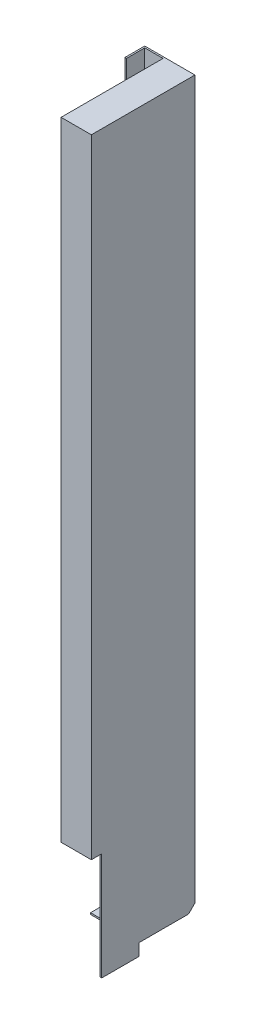
ISO-10303-21;
HEADER;
FILE_DESCRIPTION(('STEP AP214'),'2;1');
FILE_NAME('part.step','',(''),(''),'','','');
FILE_SCHEMA(('AUTOMOTIVE_DESIGN { 1 0 10303 214 1 1 1 1 }'));
ENDSEC;
DATA;
#1=APPLICATION_CONTEXT('core data for automotive mechanical design processes');
#2=APPLICATION_PROTOCOL_DEFINITION('international standard','automotive_design',2000,#1);
#3=PRODUCT_CONTEXT('',#1,'mechanical');
#4=PRODUCT('Part','Part','',(#3));
#5=PRODUCT_RELATED_PRODUCT_CATEGORY('part','',(#4));
#6=PRODUCT_DEFINITION_FORMATION('','',#4);
#7=PRODUCT_DEFINITION_CONTEXT('part definition',#1,'design');
#8=PRODUCT_DEFINITION('design','',#6,#7);
#9=PRODUCT_DEFINITION_SHAPE('','',#8);
#10=(LENGTH_UNIT() NAMED_UNIT(*) SI_UNIT(.MILLI.,.METRE.));
#11=(NAMED_UNIT(*) PLANE_ANGLE_UNIT() SI_UNIT($,.RADIAN.));
#12=(NAMED_UNIT(*) SI_UNIT($,.STERADIAN.) SOLID_ANGLE_UNIT());
#13=UNCERTAINTY_MEASURE_WITH_UNIT(LENGTH_MEASURE(1.E-05),#10,'distance_accuracy_value','');
#14=(GEOMETRIC_REPRESENTATION_CONTEXT(3) GLOBAL_UNCERTAINTY_ASSIGNED_CONTEXT((#13)) GLOBAL_UNIT_ASSIGNED_CONTEXT((#10,
#11,#12)) REPRESENTATION_CONTEXT('',''));
#15=CARTESIAN_POINT('',(0.,0.,0.));
#16=DIRECTION('',(0.,0.,1.));
#17=DIRECTION('',(1.,0.,0.));
#18=AXIS2_PLACEMENT_3D('',#15,#16,#17);
#19=CARTESIAN_POINT('',(-687.,-56.5,1959.));
#20=DIRECTION('',(0.,1.,0.));
#21=DIRECTION('',(0.,0.,-1.));
#22=AXIS2_PLACEMENT_3D('',#19,#20,#21);
#23=PLANE('',#22);
#24=DIRECTION('',(1.,0.,0.));
#25=VECTOR('',#24,1.);
#26=CARTESIAN_POINT('',(-725.,-56.5,1959.));
#27=LINE('',#26,#25);
#28=CARTESIAN_POINT('',(-725.,-56.5,1959.));
#29=VERTEX_POINT('',#28);
#30=CARTESIAN_POINT('',(-687.,-56.5,1959.));
#31=VERTEX_POINT('',#30);
#32=EDGE_CURVE('E11',#29,#31,#27,.T.);
#33=ORIENTED_EDGE('',*,*,#32,.T.);
#34=DIRECTION('',(0.,0.,-1.));
#35=VECTOR('',#34,1.);
#36=CARTESIAN_POINT('',(-687.,-56.5,1959.));
#37=LINE('',#36,#35);
#38=CARTESIAN_POINT('',(-687.,-56.5,1829.));
#39=VERTEX_POINT('',#38);
#40=EDGE_CURVE('E27',#31,#39,#37,.T.);
#41=ORIENTED_EDGE('',*,*,#40,.T.);
#42=DIRECTION('',(-1.,0.,0.));
#43=VECTOR('',#42,1.);
#44=CARTESIAN_POINT('',(-687.,-56.5,1829.));
#45=LINE('',#44,#43);
#46=CARTESIAN_POINT('',(-750.,-56.5,1829.));
#47=VERTEX_POINT('',#46);
#48=EDGE_CURVE('E223',#39,#47,#45,.T.);
#49=ORIENTED_EDGE('',*,*,#48,.T.);
#50=DIRECTION('',(0.,0.,1.));
#51=VECTOR('',#50,1.);
#52=CARTESIAN_POINT('',(-750.,-56.5,1829.));
#53=LINE('',#52,#51);
#54=CARTESIAN_POINT('',(-750.,-56.5,1854.));
#55=VERTEX_POINT('',#54);
#56=EDGE_CURVE('E221',#47,#55,#53,.T.);
#57=ORIENTED_EDGE('',*,*,#56,.T.);
#58=DIRECTION('',(1.,0.,0.));
#59=VECTOR('',#58,1.);
#60=CARTESIAN_POINT('',(-750.,-56.5,1854.));
#61=LINE('',#60,#59);
#62=CARTESIAN_POINT('',(-748.,-56.5,1854.));
#63=VERTEX_POINT('',#62);
#64=EDGE_CURVE('E224',#55,#63,#61,.T.);
#65=ORIENTED_EDGE('',*,*,#64,.T.);
#66=DIRECTION('',(0.,0.,-1.));
#67=VECTOR('',#66,1.);
#68=CARTESIAN_POINT('',(-748.,-56.5,1854.));
#69=LINE('',#68,#67);
#70=CARTESIAN_POINT('',(-748.,-56.5,1831.));
#71=VERTEX_POINT('',#70);
#72=EDGE_CURVE('E230',#63,#71,#69,.T.);
#73=ORIENTED_EDGE('',*,*,#72,.T.);
#74=DIRECTION('',(1.,0.,0.));
#75=VECTOR('',#74,1.);
#76=CARTESIAN_POINT('',(-748.,-56.5,1831.));
#77=LINE('',#76,#75);
#78=CARTESIAN_POINT('',(-725.,-56.5,1831.));
#79=VERTEX_POINT('',#78);
#80=EDGE_CURVE('E235',#71,#79,#77,.T.);
#81=ORIENTED_EDGE('',*,*,#80,.T.);
#82=DIRECTION('',(0.,0.,1.));
#83=VECTOR('',#82,1.);
#84=CARTESIAN_POINT('',(-725.,-56.5,1831.));
#85=LINE('',#84,#83);
#86=EDGE_CURVE('E244',#79,#29,#85,.T.);
#87=ORIENTED_EDGE('',*,*,#86,.T.);
#88=EDGE_LOOP('',(#33,#41,#49,#57,#65,#73,#81,#87));
#89=FACE_BOUND('',#88,.T.);
#90=ADVANCED_FACE('F17',(#89),#23,.T.);
#91=CARTESIAN_POINT('',(-725.,-984.5,1829.));
#92=DIRECTION('',(-1.,0.,0.));
#93=DIRECTION('',(0.,0.,-1.));
#94=AXIS2_PLACEMENT_3D('',#91,#92,#93);
#95=PLANE('',#94);
#96=DIRECTION('',(0.,0.,1.));
#97=VECTOR('',#96,1.);
#98=CARTESIAN_POINT('',(-725.,-58.5,1831.));
#99=LINE('',#98,#97);
#100=CARTESIAN_POINT('',(-725.,-58.5,1831.));
#101=VERTEX_POINT('',#100);
#102=CARTESIAN_POINT('',(-725.,-58.5,1957.));
#103=VERTEX_POINT('',#102);
#104=EDGE_CURVE('E247',#101,#103,#99,.T.);
#105=ORIENTED_EDGE('',*,*,#104,.T.);
#106=DIRECTION('',(0.,1.,0.));
#107=VECTOR('',#106,1.);
#108=CARTESIAN_POINT('',(-725.,-844.5,1957.));
#109=LINE('',#108,#107);
#110=CARTESIAN_POINT('',(-725.,-844.5,1957.));
#111=VERTEX_POINT('',#110);
#112=EDGE_CURVE('E209',#111,#103,#109,.T.);
#113=ORIENTED_EDGE('',*,*,#112,.F.);
#114=DIRECTION('',(0.,0.,-1.));
#115=VECTOR('',#114,1.);
#116=CARTESIAN_POINT('',(-725.,-844.5,1959.));
#117=LINE('',#116,#115);
#118=CARTESIAN_POINT('',(-725.,-844.5,1959.));
#119=VERTEX_POINT('',#118);
#120=EDGE_CURVE('E177',#119,#111,#117,.T.);
#121=ORIENTED_EDGE('',*,*,#120,.F.);
#122=DIRECTION('',(0.,1.,0.));
#123=VECTOR('',#122,1.);
#124=CARTESIAN_POINT('',(-725.,-844.5,1959.));
#125=LINE('',#124,#123);
#126=EDGE_CURVE('E258',#119,#29,#125,.T.);
#127=ORIENTED_EDGE('',*,*,#126,.T.);
#128=ORIENTED_EDGE('',*,*,#86,.F.);
#129=DIRECTION('',(0.,1.,0.));
#130=VECTOR('',#129,1.);
#131=CARTESIAN_POINT('',(-725.,-58.5,1831.));
#132=LINE('',#131,#130);
#133=EDGE_CURVE('E212',#101,#79,#132,.T.);
#134=ORIENTED_EDGE('',*,*,#133,.F.);
#135=EDGE_LOOP('',(#105,#113,#121,#127,#128,#134));
#136=FACE_BOUND('',#135,.T.);
#137=ADVANCED_FACE('F354',(#136),#95,.T.);
#138=CARTESIAN_POINT('',(-748.,-56.5,1831.));
#139=DIRECTION('',(0.,0.,1.));
#140=DIRECTION('',(0.,1.,0.));
#141=AXIS2_PLACEMENT_3D('',#138,#139,#140);
#142=PLANE('',#141);
#143=DIRECTION('',(0.,1.,0.));
#144=VECTOR('',#143,1.);
#145=CARTESIAN_POINT('',(-689.,-958.5,1831.));
#146=LINE('',#145,#144);
#147=CARTESIAN_POINT('',(-689.,-958.5,1831.));
#148=VERTEX_POINT('',#147);
#149=CARTESIAN_POINT('',(-689.,-58.5,1831.));
#150=VERTEX_POINT('',#149);
#151=EDGE_CURVE('E257',#148,#150,#146,.T.);
#152=ORIENTED_EDGE('',*,*,#151,.T.);
#153=DIRECTION('',(-1.,0.,0.));
#154=VECTOR('',#153,1.);
#155=CARTESIAN_POINT('',(-689.,-58.5,1831.));
#156=LINE('',#155,#154);
#157=EDGE_CURVE('E215',#150,#101,#156,.T.);
#158=ORIENTED_EDGE('',*,*,#157,.T.);
#159=ORIENTED_EDGE('',*,*,#133,.T.);
#160=ORIENTED_EDGE('',*,*,#80,.F.);
#161=DIRECTION('',(0.,-1.,0.));
#162=VECTOR('',#161,1.);
#163=CARTESIAN_POINT('',(-748.,-56.5,1831.));
#164=LINE('',#163,#162);
#165=CARTESIAN_POINT('',(-748.,-958.5,1831.));
#166=VERTEX_POINT('',#165);
#167=EDGE_CURVE('E21',#71,#166,#164,.T.);
#168=ORIENTED_EDGE('',*,*,#167,.T.);
#169=DIRECTION('',(1.,0.,0.));
#170=VECTOR('',#169,1.);
#171=CARTESIAN_POINT('',(-748.,-958.5,1831.));
#172=LINE('',#171,#170);
#173=EDGE_CURVE('E284',#166,#148,#172,.T.);
#174=ORIENTED_EDGE('',*,*,#173,.T.);
#175=EDGE_LOOP('',(#152,#158,#159,#160,#168,#174));
#176=FACE_BOUND('',#175,.T.);
#177=ADVANCED_FACE('F19',(#176),#142,.T.);
#178=CARTESIAN_POINT('',(-750.,-964.5,1837.));
#179=DIRECTION('',(0.,0.707106781186548,0.707106781186548));
#180=DIRECTION('',(-1.,0.,0.));
#181=AXIS2_PLACEMENT_3D('',#178,#179,#180);
#182=PLANE('',#181);
#183=ORIENTED_EDGE('',*,*,#173,.F.);
#184=DIRECTION('',(0.,-0.707106781186548,0.707106781186548));
#185=VECTOR('',#184,1.);
#186=CARTESIAN_POINT('',(-748.,-958.5,1831.));
#187=LINE('',#186,#185);
#188=CARTESIAN_POINT('',(-748.,-964.5,1837.));
#189=VERTEX_POINT('',#188);
#190=EDGE_CURVE('E282',#166,#189,#187,.T.);
#191=ORIENTED_EDGE('',*,*,#190,.T.);
#192=DIRECTION('',(1.,0.,0.));
#193=VECTOR('',#192,1.);
#194=CARTESIAN_POINT('',(-750.,-964.5,1837.));
#195=LINE('',#194,#193);
#196=CARTESIAN_POINT('',(-750.,-964.5,1837.));
#197=VERTEX_POINT('',#196);
#198=EDGE_CURVE('E131',#197,#189,#195,.T.);
#199=ORIENTED_EDGE('',*,*,#198,.F.);
#200=DIRECTION('',(0.,-0.707106781186548,0.707106781186548));
#201=VECTOR('',#200,1.);
#202=CARTESIAN_POINT('',(-750.,-956.5,1829.));
#203=LINE('',#202,#201);
#204=CARTESIAN_POINT('',(-750.,-956.5,1829.));
#205=VERTEX_POINT('',#204);
#206=EDGE_CURVE('E138',#205,#197,#203,.T.);
#207=ORIENTED_EDGE('',*,*,#206,.F.);
#208=DIRECTION('',(-1.,0.,0.));
#209=VECTOR('',#208,1.);
#210=CARTESIAN_POINT('',(-687.,-956.5,1829.));
#211=LINE('',#210,#209);
#212=CARTESIAN_POINT('',(-687.,-956.5,1829.));
#213=VERTEX_POINT('',#212);
#214=EDGE_CURVE('E201',#213,#205,#211,.T.);
#215=ORIENTED_EDGE('',*,*,#214,.F.);
#216=DIRECTION('',(0.,-0.707106781186548,0.707106781186548));
#217=VECTOR('',#216,1.);
#218=CARTESIAN_POINT('',(-687.,-956.5,1829.));
#219=LINE('',#218,#217);
#220=CARTESIAN_POINT('',(-687.,-964.5,1837.));
#221=VERTEX_POINT('',#220);
#222=EDGE_CURVE('E279',#213,#221,#219,.T.);
#223=ORIENTED_EDGE('',*,*,#222,.T.);
#224=DIRECTION('',(1.,0.,0.));
#225=VECTOR('',#224,1.);
#226=CARTESIAN_POINT('',(-689.,-964.5,1837.));
#227=LINE('',#226,#225);
#228=CARTESIAN_POINT('',(-689.,-964.5,1837.));
#229=VERTEX_POINT('',#228);
#230=EDGE_CURVE('E219',#229,#221,#227,.T.);
#231=ORIENTED_EDGE('',*,*,#230,.F.);
#232=DIRECTION('',(0.,-0.707106781186548,0.707106781186548));
#233=VECTOR('',#232,1.);
#234=CARTESIAN_POINT('',(-689.,-958.5,1831.));
#235=LINE('',#234,#233);
#236=EDGE_CURVE('E186',#148,#229,#235,.T.);
#237=ORIENTED_EDGE('',*,*,#236,.F.);
#238=EDGE_LOOP('',(#183,#191,#199,#207,#215,#223,#231,#237));
#239=FACE_BOUND('',#238,.T.);
#240=ADVANCED_FACE('F344',(#239),#182,.F.);
#241=CARTESIAN_POINT('',(-689.,-984.5,1959.));
#242=DIRECTION('',(1.,0.,0.));
#243=DIRECTION('',(0.,-1.,0.));
#244=AXIS2_PLACEMENT_3D('',#241,#242,#243);
#245=PLANE('',#244);
#246=DIRECTION('',(0.,1.,0.));
#247=VECTOR('',#246,1.);
#248=CARTESIAN_POINT('',(-689.,-979.5,1946.));
#249=LINE('',#248,#247);
#250=CARTESIAN_POINT('',(-689.,-979.5,1946.));
#251=VERTEX_POINT('',#250);
#252=CARTESIAN_POINT('',(-689.,-844.5,1946.));
#253=VERTEX_POINT('',#252);
#254=EDGE_CURVE('E277',#251,#253,#249,.T.);
#255=ORIENTED_EDGE('',*,*,#254,.T.);
#256=DIRECTION('',(0.,0.,-1.));
#257=VECTOR('',#256,1.);
#258=CARTESIAN_POINT('',(-689.,-844.5,1957.));
#259=LINE('',#258,#257);
#260=CARTESIAN_POINT('',(-689.,-844.5,1957.));
#261=VERTEX_POINT('',#260);
#262=EDGE_CURVE('E182',#261,#253,#259,.T.);
#263=ORIENTED_EDGE('',*,*,#262,.F.);
#264=DIRECTION('',(0.,1.,0.));
#265=VECTOR('',#264,1.);
#266=CARTESIAN_POINT('',(-689.,-844.5,1957.));
#267=LINE('',#266,#265);
#268=CARTESIAN_POINT('',(-689.,-58.5,1957.));
#269=VERTEX_POINT('',#268);
#270=EDGE_CURVE('E243',#261,#269,#267,.T.);
#271=ORIENTED_EDGE('',*,*,#270,.T.);
#272=DIRECTION('',(0.,0.,-1.));
#273=VECTOR('',#272,1.);
#274=CARTESIAN_POINT('',(-689.,-58.5,1957.));
#275=LINE('',#274,#273);
#276=EDGE_CURVE('E240',#269,#150,#275,.T.);
#277=ORIENTED_EDGE('',*,*,#276,.T.);
#278=ORIENTED_EDGE('',*,*,#151,.F.);
#279=ORIENTED_EDGE('',*,*,#236,.T.);
#280=DIRECTION('',(0.,-1.,0.));
#281=VECTOR('',#280,1.);
#282=CARTESIAN_POINT('',(-689.,-962.5,1837.));
#283=LINE('',#282,#281);
#284=CARTESIAN_POINT('',(-689.,-962.5,1837.));
#285=VERTEX_POINT('',#284);
#286=EDGE_CURVE('E164',#285,#229,#283,.T.);
#287=ORIENTED_EDGE('',*,*,#286,.F.);
#288=DIRECTION('',(0.,0.,-1.));
#289=VECTOR('',#288,1.);
#290=CARTESIAN_POINT('',(-689.,-962.5,1899.));
#291=LINE('',#290,#289);
#292=CARTESIAN_POINT('',(-689.,-962.5,1899.));
#293=VERTEX_POINT('',#292);
#294=EDGE_CURVE('E160',#293,#285,#291,.T.);
#295=ORIENTED_EDGE('',*,*,#294,.F.);
#296=DIRECTION('',(0.,1.,0.));
#297=VECTOR('',#296,1.);
#298=CARTESIAN_POINT('',(-689.,-964.5,1899.));
#299=LINE('',#298,#297);
#300=CARTESIAN_POINT('',(-689.,-964.5,1899.));
#301=VERTEX_POINT('',#300);
#302=EDGE_CURVE('E147',#301,#293,#299,.T.);
#303=ORIENTED_EDGE('',*,*,#302,.F.);
#304=DIRECTION('',(0.,1.,0.));
#305=VECTOR('',#304,1.);
#306=CARTESIAN_POINT('',(-689.,-979.5,1899.));
#307=LINE('',#306,#305);
#308=CARTESIAN_POINT('',(-689.,-979.5,1899.));
#309=VERTEX_POINT('',#308);
#310=EDGE_CURVE('E188',#309,#301,#307,.T.);
#311=ORIENTED_EDGE('',*,*,#310,.F.);
#312=DIRECTION('',(0.,0.,-1.));
#313=VECTOR('',#312,1.);
#314=CARTESIAN_POINT('',(-689.,-979.5,1946.));
#315=LINE('',#314,#313);
#316=EDGE_CURVE('E183',#251,#309,#315,.T.);
#317=ORIENTED_EDGE('',*,*,#316,.F.);
#318=EDGE_LOOP('',(#255,#263,#271,#277,#278,#279,#287,#295,#303,#311,#317));
#319=FACE_BOUND('',#318,.T.);
#320=ADVANCED_FACE('F162',(#319),#245,.F.);
#321=CARTESIAN_POINT('',(-689.,-979.5,1946.));
#322=DIRECTION('',(0.,1.,0.));
#323=DIRECTION('',(0.,0.,-1.));
#324=AXIS2_PLACEMENT_3D('',#321,#322,#323);
#325=PLANE('',#324);
#326=DIRECTION('',(1.,0.,0.));
#327=VECTOR('',#326,1.);
#328=CARTESIAN_POINT('',(-689.,-979.5,1946.));
#329=LINE('',#328,#327);
#330=CARTESIAN_POINT('',(-687.,-979.5,1946.));
#331=VERTEX_POINT('',#330);
#332=EDGE_CURVE('E193',#251,#331,#329,.T.);
#333=ORIENTED_EDGE('',*,*,#332,.F.);
#334=ORIENTED_EDGE('',*,*,#316,.T.);
#335=DIRECTION('',(-1.,0.,0.));
#336=VECTOR('',#335,1.);
#337=CARTESIAN_POINT('',(-687.,-979.5,1899.));
#338=LINE('',#337,#336);
#339=CARTESIAN_POINT('',(-687.,-979.5,1899.));
#340=VERTEX_POINT('',#339);
#341=EDGE_CURVE('E250',#340,#309,#338,.T.);
#342=ORIENTED_EDGE('',*,*,#341,.F.);
#343=DIRECTION('',(0.,0.,-1.));
#344=VECTOR('',#343,1.);
#345=CARTESIAN_POINT('',(-687.,-979.5,1946.));
#346=LINE('',#345,#344);
#347=EDGE_CURVE('E197',#331,#340,#346,.T.);
#348=ORIENTED_EDGE('',*,*,#347,.F.);
#349=EDGE_LOOP('',(#333,#334,#342,#348));
#350=FACE_BOUND('',#349,.T.);
#351=ADVANCED_FACE('F332',(#350),#325,.F.);
#352=CARTESIAN_POINT('',(-687.,-984.5,1959.));
#353=DIRECTION('',(1.,0.,0.));
#354=DIRECTION('',(0.,-1.,0.));
#355=AXIS2_PLACEMENT_3D('',#352,#353,#354);
#356=PLANE('',#355);
#357=DIRECTION('',(0.,1.,0.));
#358=VECTOR('',#357,1.);
#359=CARTESIAN_POINT('',(-687.,-979.5,1899.));
#360=LINE('',#359,#358);
#361=CARTESIAN_POINT('',(-687.,-964.5,1899.));
#362=VERTEX_POINT('',#361);
#363=EDGE_CURVE('E187',#340,#362,#360,.T.);
#364=ORIENTED_EDGE('',*,*,#363,.T.);
#365=DIRECTION('',(0.,0.,-1.));
#366=VECTOR('',#365,1.);
#367=CARTESIAN_POINT('',(-687.,-964.5,1899.));
#368=LINE('',#367,#366);
#369=EDGE_CURVE('E292',#362,#221,#368,.T.);
#370=ORIENTED_EDGE('',*,*,#369,.T.);
#371=ORIENTED_EDGE('',*,*,#222,.F.);
#372=DIRECTION('',(0.,1.,0.));
#373=VECTOR('',#372,1.);
#374=CARTESIAN_POINT('',(-687.,-956.5,1829.));
#375=LINE('',#374,#373);
#376=EDGE_CURVE('E295',#213,#39,#375,.T.);
#377=ORIENTED_EDGE('',*,*,#376,.T.);
#378=ORIENTED_EDGE('',*,*,#40,.F.);
#379=DIRECTION('',(0.,1.,0.));
#380=VECTOR('',#379,1.);
#381=CARTESIAN_POINT('',(-687.,-844.5,1959.));
#382=LINE('',#381,#380);
#383=CARTESIAN_POINT('',(-687.,-844.5,1959.));
#384=VERTEX_POINT('',#383);
#385=EDGE_CURVE('E95',#384,#31,#382,.T.);
#386=ORIENTED_EDGE('',*,*,#385,.F.);
#387=DIRECTION('',(0.,0.,-1.));
#388=VECTOR('',#387,1.);
#389=CARTESIAN_POINT('',(-687.,-844.5,1959.));
#390=LINE('',#389,#388);
#391=CARTESIAN_POINT('',(-687.,-844.5,1946.));
#392=VERTEX_POINT('',#391);
#393=EDGE_CURVE('E288',#384,#392,#390,.T.);
#394=ORIENTED_EDGE('',*,*,#393,.T.);
#395=DIRECTION('',(0.,1.,0.));
#396=VECTOR('',#395,1.);
#397=CARTESIAN_POINT('',(-687.,-979.5,1946.));
#398=LINE('',#397,#396);
#399=EDGE_CURVE('E106',#331,#392,#398,.T.);
#400=ORIENTED_EDGE('',*,*,#399,.F.);
#401=ORIENTED_EDGE('',*,*,#347,.T.);
#402=EDGE_LOOP('',(#364,#370,#371,#377,#378,#386,#394,#400,#401));
#403=FACE_BOUND('',#402,.T.);
#404=ADVANCED_FACE('F325',(#403),#356,.T.);
#405=CARTESIAN_POINT('',(-687.,-984.5,1946.));
#406=DIRECTION('',(0.,0.,-1.));
#407=DIRECTION('',(-1.,0.,0.));
#408=AXIS2_PLACEMENT_3D('',#405,#406,#407);
#409=PLANE('',#408);
#410=ORIENTED_EDGE('',*,*,#399,.T.);
#411=DIRECTION('',(-1.,0.,0.));
#412=VECTOR('',#411,1.);
#413=CARTESIAN_POINT('',(-687.,-844.5,1946.));
#414=LINE('',#413,#412);
#415=EDGE_CURVE('E195',#392,#253,#414,.T.);
#416=ORIENTED_EDGE('',*,*,#415,.T.);
#417=ORIENTED_EDGE('',*,*,#254,.F.);
#418=ORIENTED_EDGE('',*,*,#332,.T.);
#419=EDGE_LOOP('',(#410,#416,#417,#418));
#420=FACE_BOUND('',#419,.T.);
#421=ADVANCED_FACE('F330',(#420),#409,.F.);
#422=CARTESIAN_POINT('',(-687.,-844.5,1946.));
#423=DIRECTION('',(0.,1.,0.));
#424=DIRECTION('',(0.,0.,-1.));
#425=AXIS2_PLACEMENT_3D('',#422,#423,#424);
#426=PLANE('',#425);
#427=DIRECTION('',(1.,0.,0.));
#428=VECTOR('',#427,1.);
#429=CARTESIAN_POINT('',(-725.,-844.5,1959.));
#430=LINE('',#429,#428);
#431=EDGE_CURVE('E266',#119,#384,#430,.T.);
#432=ORIENTED_EDGE('',*,*,#431,.F.);
#433=ORIENTED_EDGE('',*,*,#120,.T.);
#434=DIRECTION('',(1.,0.,0.));
#435=VECTOR('',#434,1.);
#436=CARTESIAN_POINT('',(-725.,-844.5,1957.));
#437=LINE('',#436,#435);
#438=EDGE_CURVE('E179',#111,#261,#437,.T.);
#439=ORIENTED_EDGE('',*,*,#438,.T.);
#440=ORIENTED_EDGE('',*,*,#262,.T.);
#441=ORIENTED_EDGE('',*,*,#415,.F.);
#442=ORIENTED_EDGE('',*,*,#393,.F.);
#443=EDGE_LOOP('',(#432,#433,#439,#440,#441,#442));
#444=FACE_BOUND('',#443,.T.);
#445=ADVANCED_FACE('F322',(#444),#426,.F.);
#446=CARTESIAN_POINT('',(-725.,-984.5,1957.));
#447=DIRECTION('',(0.,0.,1.));
#448=DIRECTION('',(0.,1.,0.));
#449=AXIS2_PLACEMENT_3D('',#446,#447,#448);
#450=PLANE('',#449);
#451=ORIENTED_EDGE('',*,*,#112,.T.);
#452=DIRECTION('',(1.,0.,0.));
#453=VECTOR('',#452,1.);
#454=CARTESIAN_POINT('',(-725.,-58.5,1957.));
#455=LINE('',#454,#453);
#456=EDGE_CURVE('E211',#103,#269,#455,.T.);
#457=ORIENTED_EDGE('',*,*,#456,.T.);
#458=ORIENTED_EDGE('',*,*,#270,.F.);
#459=ORIENTED_EDGE('',*,*,#438,.F.);
#460=EDGE_LOOP('',(#451,#457,#458,#459));
#461=FACE_BOUND('',#460,.T.);
#462=ADVANCED_FACE('F358',(#461),#450,.F.);
#463=CARTESIAN_POINT('',(-687.,-58.5,1959.));
#464=DIRECTION('',(0.,1.,0.));
#465=DIRECTION('',(0.,0.,-1.));
#466=AXIS2_PLACEMENT_3D('',#463,#464,#465);
#467=PLANE('',#466);
#468=ORIENTED_EDGE('',*,*,#276,.F.);
#469=ORIENTED_EDGE('',*,*,#456,.F.);
#470=ORIENTED_EDGE('',*,*,#104,.F.);
#471=ORIENTED_EDGE('',*,*,#157,.F.);
#472=EDGE_LOOP('',(#468,#469,#470,#471));
#473=FACE_BOUND('',#472,.T.);
#474=ADVANCED_FACE('F387',(#473),#467,.F.);
#475=CARTESIAN_POINT('',(-725.,-984.5,1959.));
#476=DIRECTION('',(0.,0.,1.));
#477=DIRECTION('',(0.,1.,0.));
#478=AXIS2_PLACEMENT_3D('',#475,#476,#477);
#479=PLANE('',#478);
#480=ORIENTED_EDGE('',*,*,#385,.T.);
#481=ORIENTED_EDGE('',*,*,#32,.F.);
#482=ORIENTED_EDGE('',*,*,#126,.F.);
#483=ORIENTED_EDGE('',*,*,#431,.T.);
#484=EDGE_LOOP('',(#480,#481,#482,#483));
#485=FACE_BOUND('',#484,.T.);
#486=ADVANCED_FACE('F317',(#485),#479,.T.);
#487=CARTESIAN_POINT('',(-687.,-984.5,1829.));
#488=DIRECTION('',(0.,0.,-1.));
#489=DIRECTION('',(-1.,0.,0.));
#490=AXIS2_PLACEMENT_3D('',#487,#488,#489);
#491=PLANE('',#490);
#492=DIRECTION('',(0.,-1.,0.));
#493=VECTOR('',#492,1.);
#494=CARTESIAN_POINT('',(-750.,-56.5,1829.));
#495=LINE('',#494,#493);
#496=EDGE_CURVE('E198',#47,#205,#495,.T.);
#497=ORIENTED_EDGE('',*,*,#496,.F.);
#498=ORIENTED_EDGE('',*,*,#48,.F.);
#499=ORIENTED_EDGE('',*,*,#376,.F.);
#500=ORIENTED_EDGE('',*,*,#214,.T.);
#501=EDGE_LOOP('',(#497,#498,#499,#500));
#502=FACE_BOUND('',#501,.T.);
#503=ADVANCED_FACE('F347',(#502),#491,.T.);
#504=CARTESIAN_POINT('',(-750.,-56.5,1829.));
#505=DIRECTION('',(-1.,0.,0.));
#506=DIRECTION('',(0.,0.,-1.));
#507=AXIS2_PLACEMENT_3D('',#504,#505,#506);
#508=PLANE('',#507);
#509=DIRECTION('',(0.,-1.,0.));
#510=VECTOR('',#509,1.);
#511=CARTESIAN_POINT('',(-750.,-56.5,1854.));
#512=LINE('',#511,#510);
#513=CARTESIAN_POINT('',(-750.,-964.5,1854.));
#514=VERTEX_POINT('',#513);
#515=EDGE_CURVE('E202',#55,#514,#512,.T.);
#516=ORIENTED_EDGE('',*,*,#515,.F.);
#517=ORIENTED_EDGE('',*,*,#56,.F.);
#518=ORIENTED_EDGE('',*,*,#496,.T.);
#519=ORIENTED_EDGE('',*,*,#206,.T.);
#520=DIRECTION('',(0.,0.,-1.));
#521=VECTOR('',#520,1.);
#522=CARTESIAN_POINT('',(-750.,-964.5,1854.));
#523=LINE('',#522,#521);
#524=EDGE_CURVE('E267',#514,#197,#523,.T.);
#525=ORIENTED_EDGE('',*,*,#524,.F.);
#526=EDGE_LOOP('',(#516,#517,#518,#519,#525));
#527=FACE_BOUND('',#526,.T.);
#528=ADVANCED_FACE('F349',(#527),#508,.T.);
#529=CARTESIAN_POINT('',(-750.,-964.5,1899.));
#530=DIRECTION('',(0.,1.,0.));
#531=DIRECTION('',(0.,0.,-1.));
#532=AXIS2_PLACEMENT_3D('',#529,#530,#531);
#533=PLANE('',#532);
#534=ORIENTED_EDGE('',*,*,#369,.F.);
#535=DIRECTION('',(1.,0.,0.));
#536=VECTOR('',#535,1.);
#537=CARTESIAN_POINT('',(-689.,-964.5,1899.));
#538=LINE('',#537,#536);
#539=EDGE_CURVE('E192',#301,#362,#538,.T.);
#540=ORIENTED_EDGE('',*,*,#539,.F.);
#541=DIRECTION('',(-1.,0.,0.));
#542=VECTOR('',#541,1.);
#543=CARTESIAN_POINT('',(-689.,-964.5,1899.));
#544=LINE('',#543,#542);
#545=CARTESIAN_POINT('',(-748.,-964.5,1899.));
#546=VERTEX_POINT('',#545);
#547=EDGE_CURVE('E155',#301,#546,#544,.T.);
#548=ORIENTED_EDGE('',*,*,#547,.T.);
#549=DIRECTION('',(0.,0.,1.));
#550=VECTOR('',#549,1.);
#551=CARTESIAN_POINT('',(-748.,-964.5,1854.));
#552=LINE('',#551,#550);
#553=CARTESIAN_POINT('',(-748.,-964.5,1854.));
#554=VERTEX_POINT('',#553);
#555=EDGE_CURVE('E157',#554,#546,#552,.T.);
#556=ORIENTED_EDGE('',*,*,#555,.F.);
#557=DIRECTION('',(1.,0.,0.));
#558=VECTOR('',#557,1.);
#559=CARTESIAN_POINT('',(-750.,-964.5,1854.));
#560=LINE('',#559,#558);
#561=EDGE_CURVE('E204',#514,#554,#560,.T.);
#562=ORIENTED_EDGE('',*,*,#561,.F.);
#563=ORIENTED_EDGE('',*,*,#524,.T.);
#564=ORIENTED_EDGE('',*,*,#198,.T.);
#565=DIRECTION('',(-1.,0.,0.));
#566=VECTOR('',#565,1.);
#567=CARTESIAN_POINT('',(-689.,-964.5,1837.));
#568=LINE('',#567,#566);
#569=EDGE_CURVE('E218',#229,#189,#568,.T.);
#570=ORIENTED_EDGE('',*,*,#569,.F.);
#571=ORIENTED_EDGE('',*,*,#230,.T.);
#572=EDGE_LOOP('',(#534,#540,#548,#556,#562,#563,#564,#570,#571));
#573=FACE_BOUND('',#572,.T.);
#574=ADVANCED_FACE('F339',(#573),#533,.F.);
#575=CARTESIAN_POINT('',(-689.,-962.5,1837.));
#576=DIRECTION('',(0.,0.,-1.));
#577=DIRECTION('',(-1.,0.,0.));
#578=AXIS2_PLACEMENT_3D('',#575,#576,#577);
#579=PLANE('',#578);
#580=ORIENTED_EDGE('',*,*,#569,.T.);
#581=DIRECTION('',(0.,1.,0.));
#582=VECTOR('',#581,1.);
#583=CARTESIAN_POINT('',(-748.,-964.5,1837.));
#584=LINE('',#583,#582);
#585=CARTESIAN_POINT('',(-748.,-962.5,1837.));
#586=VERTEX_POINT('',#585);
#587=EDGE_CURVE('E220',#189,#586,#584,.T.);
#588=ORIENTED_EDGE('',*,*,#587,.T.);
#589=DIRECTION('',(-1.,0.,0.));
#590=VECTOR('',#589,1.);
#591=CARTESIAN_POINT('',(-689.,-962.5,1837.));
#592=LINE('',#591,#590);
#593=EDGE_CURVE('E168',#285,#586,#592,.T.);
#594=ORIENTED_EDGE('',*,*,#593,.F.);
#595=ORIENTED_EDGE('',*,*,#286,.T.);
#596=EDGE_LOOP('',(#580,#588,#594,#595));
#597=FACE_BOUND('',#596,.T.);
#598=ADVANCED_FACE('F365',(#597),#579,.T.);
#599=CARTESIAN_POINT('',(-689.,-962.5,1899.));
#600=DIRECTION('',(0.,1.,0.));
#601=DIRECTION('',(0.,0.,-1.));
#602=AXIS2_PLACEMENT_3D('',#599,#600,#601);
#603=PLANE('',#602);
#604=ORIENTED_EDGE('',*,*,#593,.T.);
#605=DIRECTION('',(0.,0.,-1.));
#606=VECTOR('',#605,1.);
#607=CARTESIAN_POINT('',(-748.,-962.5,1854.));
#608=LINE('',#607,#606);
#609=CARTESIAN_POINT('',(-748.,-962.5,1854.));
#610=VERTEX_POINT('',#609);
#611=EDGE_CURVE('E191',#610,#586,#608,.T.);
#612=ORIENTED_EDGE('',*,*,#611,.F.);
#613=DIRECTION('',(0.,0.,-1.));
#614=VECTOR('',#613,1.);
#615=CARTESIAN_POINT('',(-748.,-962.5,1899.));
#616=LINE('',#615,#614);
#617=CARTESIAN_POINT('',(-748.,-962.5,1899.));
#618=VERTEX_POINT('',#617);
#619=EDGE_CURVE('E173',#618,#610,#616,.T.);
#620=ORIENTED_EDGE('',*,*,#619,.F.);
#621=DIRECTION('',(-1.,0.,0.));
#622=VECTOR('',#621,1.);
#623=CARTESIAN_POINT('',(-689.,-962.5,1899.));
#624=LINE('',#623,#622);
#625=EDGE_CURVE('E152',#293,#618,#624,.T.);
#626=ORIENTED_EDGE('',*,*,#625,.F.);
#627=ORIENTED_EDGE('',*,*,#294,.T.);
#628=EDGE_LOOP('',(#604,#612,#620,#626,#627));
#629=FACE_BOUND('',#628,.T.);
#630=ADVANCED_FACE('F171',(#629),#603,.T.);
#631=CARTESIAN_POINT('',(-689.,-964.5,1899.));
#632=DIRECTION('',(0.,0.,1.));
#633=DIRECTION('',(0.,1.,0.));
#634=AXIS2_PLACEMENT_3D('',#631,#632,#633);
#635=PLANE('',#634);
#636=ORIENTED_EDGE('',*,*,#625,.T.);
#637=DIRECTION('',(0.,1.,0.));
#638=VECTOR('',#637,1.);
#639=CARTESIAN_POINT('',(-748.,-964.5,1899.));
#640=LINE('',#639,#638);
#641=EDGE_CURVE('E253',#546,#618,#640,.T.);
#642=ORIENTED_EDGE('',*,*,#641,.F.);
#643=ORIENTED_EDGE('',*,*,#547,.F.);
#644=ORIENTED_EDGE('',*,*,#302,.T.);
#645=EDGE_LOOP('',(#636,#642,#643,#644));
#646=FACE_BOUND('',#645,.T.);
#647=ADVANCED_FACE('F149',(#646),#635,.T.);
#648=CARTESIAN_POINT('',(-748.,-56.5,1854.));
#649=DIRECTION('',(1.,0.,0.));
#650=DIRECTION('',(0.,-1.,0.));
#651=AXIS2_PLACEMENT_3D('',#648,#649,#650);
#652=PLANE('',#651);
#653=ORIENTED_EDGE('',*,*,#555,.T.);
#654=ORIENTED_EDGE('',*,*,#641,.T.);
#655=ORIENTED_EDGE('',*,*,#619,.T.);
#656=DIRECTION('',(0.,1.,0.));
#657=VECTOR('',#656,1.);
#658=CARTESIAN_POINT('',(-748.,-964.5,1854.));
#659=LINE('',#658,#657);
#660=EDGE_CURVE('E208',#554,#610,#659,.T.);
#661=ORIENTED_EDGE('',*,*,#660,.F.);
#662=EDGE_LOOP('',(#653,#654,#655,#661));
#663=FACE_BOUND('',#662,.T.);
#664=ADVANCED_FACE('F381',(#663),#652,.F.);
#665=CARTESIAN_POINT('',(-750.,-56.5,1854.));
#666=DIRECTION('',(0.,0.,1.));
#667=DIRECTION('',(0.,1.,0.));
#668=AXIS2_PLACEMENT_3D('',#665,#666,#667);
#669=PLANE('',#668);
#670=DIRECTION('',(0.,-1.,0.));
#671=VECTOR('',#670,1.);
#672=CARTESIAN_POINT('',(-748.,-56.5,1854.));
#673=LINE('',#672,#671);
#674=EDGE_CURVE('E205',#63,#610,#673,.T.);
#675=ORIENTED_EDGE('',*,*,#674,.F.);
#676=ORIENTED_EDGE('',*,*,#64,.F.);
#677=ORIENTED_EDGE('',*,*,#515,.T.);
#678=ORIENTED_EDGE('',*,*,#561,.T.);
#679=ORIENTED_EDGE('',*,*,#660,.T.);
#680=EDGE_LOOP('',(#675,#676,#677,#678,#679));
#681=FACE_BOUND('',#680,.T.);
#682=ADVANCED_FACE('F372',(#681),#669,.T.);
#683=CARTESIAN_POINT('',(-748.,-56.5,1854.));
#684=DIRECTION('',(1.,0.,0.));
#685=DIRECTION('',(0.,-1.,0.));
#686=AXIS2_PLACEMENT_3D('',#683,#684,#685);
#687=PLANE('',#686);
#688=ORIENTED_EDGE('',*,*,#587,.F.);
#689=ORIENTED_EDGE('',*,*,#190,.F.);
#690=ORIENTED_EDGE('',*,*,#167,.F.);
#691=ORIENTED_EDGE('',*,*,#72,.F.);
#692=ORIENTED_EDGE('',*,*,#674,.T.);
#693=ORIENTED_EDGE('',*,*,#611,.T.);
#694=EDGE_LOOP('',(#688,#689,#690,#691,#692,#693));
#695=FACE_BOUND('',#694,.T.);
#696=ADVANCED_FACE('F368',(#695),#687,.T.);
#697=CARTESIAN_POINT('',(-750.,-984.5,1899.));
#698=DIRECTION('',(0.,0.,1.));
#699=DIRECTION('',(0.,1.,0.));
#700=AXIS2_PLACEMENT_3D('',#697,#698,#699);
#701=PLANE('',#700);
#702=ORIENTED_EDGE('',*,*,#310,.T.);
#703=ORIENTED_EDGE('',*,*,#539,.T.);
#704=ORIENTED_EDGE('',*,*,#363,.F.);
#705=ORIENTED_EDGE('',*,*,#341,.T.);
#706=EDGE_LOOP('',(#702,#703,#704,#705));
#707=FACE_BOUND('',#706,.T.);
#708=ADVANCED_FACE('F335',(#707),#701,.F.);
#709=CLOSED_SHELL('',(#90,#137,#177,#240,#320,#351,#404,#421,#445,#462,#474,#486,#503,#528,#574,
#598,#630,#647,#664,#682,#696,#708));
#710=MANIFOLD_SOLID_BREP('B1',#709);
#711=ADVANCED_BREP_SHAPE_REPRESENTATION('',(#18,#710),#14);
#712=SHAPE_DEFINITION_REPRESENTATION(#9,#711);
ENDSEC;
END-ISO-10303-21;
